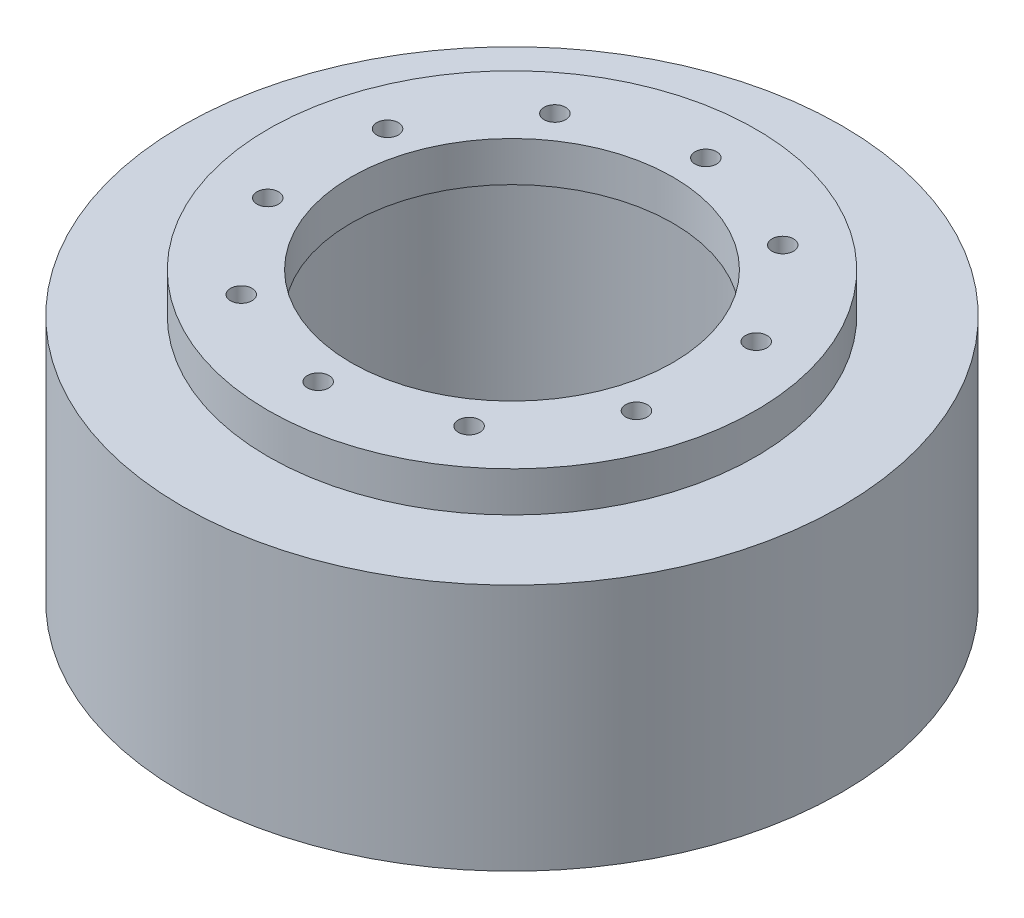
ISO-10303-21;
HEADER;
FILE_DESCRIPTION(('STEP AP214'),'2;1');
FILE_NAME('part.step','',(''),(''),'','','');
FILE_SCHEMA(('AUTOMOTIVE_DESIGN { 1 0 10303 214 1 1 1 1 }'));
ENDSEC;
DATA;
#1=APPLICATION_CONTEXT('core data for automotive mechanical design processes');
#2=APPLICATION_PROTOCOL_DEFINITION('international standard','automotive_design',2000,#1);
#3=PRODUCT_CONTEXT('',#1,'mechanical');
#4=PRODUCT('Part','Part','',(#3));
#5=PRODUCT_RELATED_PRODUCT_CATEGORY('part','',(#4));
#6=PRODUCT_DEFINITION_FORMATION('','',#4);
#7=PRODUCT_DEFINITION_CONTEXT('part definition',#1,'design');
#8=PRODUCT_DEFINITION('design','',#6,#7);
#9=PRODUCT_DEFINITION_SHAPE('','',#8);
#10=(LENGTH_UNIT() NAMED_UNIT(*) SI_UNIT(.MILLI.,.METRE.));
#11=(NAMED_UNIT(*) PLANE_ANGLE_UNIT() SI_UNIT($,.RADIAN.));
#12=(NAMED_UNIT(*) SI_UNIT($,.STERADIAN.) SOLID_ANGLE_UNIT());
#13=UNCERTAINTY_MEASURE_WITH_UNIT(LENGTH_MEASURE(1.E-05),#10,'distance_accuracy_value','');
#14=(GEOMETRIC_REPRESENTATION_CONTEXT(3) GLOBAL_UNCERTAINTY_ASSIGNED_CONTEXT((#13)) GLOBAL_UNIT_ASSIGNED_CONTEXT((#10,
#11,#12)) REPRESENTATION_CONTEXT('',''));
#15=CARTESIAN_POINT('',(0.,0.,0.));
#16=DIRECTION('',(0.,0.,1.));
#17=DIRECTION('',(1.,0.,0.));
#18=AXIS2_PLACEMENT_3D('',#15,#16,#17);
#19=CARTESIAN_POINT('',(0.,0.,0.));
#20=DIRECTION('',(0.,1.,0.));
#21=DIRECTION('',(0.,0.,1.));
#22=AXIS2_PLACEMENT_3D('',#19,#20,#21);
#23=PLANE('',#22);
#24=CARTESIAN_POINT('',(0.,0.,0.));
#25=DIRECTION('',(0.,1.,0.));
#26=DIRECTION('',(0.,0.,1.));
#27=AXIS2_PLACEMENT_3D('',#24,#25,#26);
#28=CIRCLE('',#27,82.5);
#29=CARTESIAN_POINT('',(0.,0.,82.5));
#30=VERTEX_POINT('',#29);
#31=EDGE_CURVE('E282',#30,#30,#28,.T.);
#32=ORIENTED_EDGE('',*,*,#31,.F.);
#33=EDGE_LOOP('',(#32));
#34=FACE_BOUND('',#33,.T.);
#35=CARTESIAN_POINT('',(0.,0.,69.5));
#36=DIRECTION('',(0.,-1.,0.));
#37=DIRECTION('',(0.,0.,-1.));
#38=AXIS2_PLACEMENT_3D('',#35,#36,#37);
#39=CIRCLE('',#38,4.66);
#40=CARTESIAN_POINT('',(0.,0.,64.84));
#41=VERTEX_POINT('',#40);
#42=EDGE_CURVE('E195',#41,#41,#39,.T.);
#43=ORIENTED_EDGE('',*,*,#42,.F.);
#44=EDGE_LOOP('',(#43));
#45=FACE_BOUND('',#44,.T.);
#46=CARTESIAN_POINT('',(60.1887655630186,0.,34.7499999999999));
#47=DIRECTION('',(0.,-1.,0.));
#48=DIRECTION('',(-0.86602540378444,0.,-0.499999999999998));
#49=AXIS2_PLACEMENT_3D('',#46,#47,#48);
#50=CIRCLE('',#49,4.66);
#51=CARTESIAN_POINT('',(56.1530871813831,0.,32.4199999999999));
#52=VERTEX_POINT('',#51);
#53=EDGE_CURVE('E171',#52,#52,#50,.T.);
#54=ORIENTED_EDGE('',*,*,#53,.F.);
#55=EDGE_LOOP('',(#54));
#56=FACE_BOUND('',#55,.T.);
#57=CARTESIAN_POINT('',(60.1887655630183,0.,-34.7500000000003));
#58=DIRECTION('',(0.,-1.,0.));
#59=DIRECTION('',(-0.866025403784436,0.,0.500000000000004));
#60=AXIS2_PLACEMENT_3D('',#57,#58,#59);
#61=CIRCLE('',#60,4.66);
#62=CARTESIAN_POINT('',(56.1530871813829,0.,-32.4200000000003));
#63=VERTEX_POINT('',#62);
#64=EDGE_CURVE('E172',#63,#63,#61,.T.);
#65=ORIENTED_EDGE('',*,*,#64,.F.);
#66=EDGE_LOOP('',(#65));
#67=FACE_BOUND('',#66,.T.);
#68=CARTESIAN_POINT('',(0.,0.,-69.5));
#69=DIRECTION('',(0.,-1.,0.));
#70=DIRECTION('',(0.,0.,1.));
#71=AXIS2_PLACEMENT_3D('',#68,#69,#70);
#72=CIRCLE('',#71,4.66);
#73=CARTESIAN_POINT('',(0.,0.,-64.84));
#74=VERTEX_POINT('',#73);
#75=EDGE_CURVE('E178',#74,#74,#72,.T.);
#76=ORIENTED_EDGE('',*,*,#75,.F.);
#77=EDGE_LOOP('',(#76));
#78=FACE_BOUND('',#77,.T.);
#79=CARTESIAN_POINT('',(-60.1887655630188,0.,-34.7499999999994));
#80=DIRECTION('',(0.,-1.,0.));
#81=DIRECTION('',(0.866025403784443,0.,0.499999999999992));
#82=AXIS2_PLACEMENT_3D('',#79,#80,#81);
#83=CIRCLE('',#82,4.66);
#84=CARTESIAN_POINT('',(-56.1530871813833,0.,-32.4199999999995));
#85=VERTEX_POINT('',#84);
#86=EDGE_CURVE('E184',#85,#85,#83,.T.);
#87=ORIENTED_EDGE('',*,*,#86,.F.);
#88=EDGE_LOOP('',(#87));
#89=FACE_BOUND('',#88,.T.);
#90=CARTESIAN_POINT('',(-60.1887655630181,0.,34.7500000000007));
#91=DIRECTION('',(0.,-1.,0.));
#92=DIRECTION('',(0.866025403784433,0.,-0.50000000000001));
#93=AXIS2_PLACEMENT_3D('',#90,#91,#92);
#94=CIRCLE('',#93,4.66);
#95=CARTESIAN_POINT('',(-56.1530871813826,0.,32.4200000000007));
#96=VERTEX_POINT('',#95);
#97=EDGE_CURVE('E161',#96,#96,#94,.T.);
#98=ORIENTED_EDGE('',*,*,#97,.F.);
#99=EDGE_LOOP('',(#98));
#100=FACE_BOUND('',#99,.T.);
#101=DIRECTION('',(1.,0.,0.));
#102=VECTOR('',#101,1.);
#103=CARTESIAN_POINT('',(-71.0367514640186,0.,20.5));
#104=LINE('',#103,#102);
#105=CARTESIAN_POINT('',(-71.0367514640186,0.,20.5));
#106=VERTEX_POINT('',#105);
#107=CARTESIAN_POINT('',(-51.0367514640186,0.,20.5));
#108=VERTEX_POINT('',#107);
#109=EDGE_CURVE('E125',#106,#108,#104,.T.);
#110=ORIENTED_EDGE('',*,*,#109,.T.);
#111=CARTESIAN_POINT('',(0.,0.,0.));
#112=DIRECTION('',(0.,1.,0.));
#113=DIRECTION('',(0.,0.,1.));
#114=AXIS2_PLACEMENT_3D('',#111,#112,#113);
#115=CIRCLE('',#114,55.);
#116=CARTESIAN_POINT('',(51.0367514640186,0.,20.5));
#117=VERTEX_POINT('',#116);
#118=EDGE_CURVE('E278',#108,#117,#115,.T.);
#119=ORIENTED_EDGE('',*,*,#118,.T.);
#120=DIRECTION('',(-1.,0.,0.));
#121=VECTOR('',#120,1.);
#122=CARTESIAN_POINT('',(71.0367514640186,0.,20.5));
#123=LINE('',#122,#121);
#124=CARTESIAN_POINT('',(71.0367514640186,0.,20.5));
#125=VERTEX_POINT('',#124);
#126=EDGE_CURVE('E154',#125,#117,#123,.T.);
#127=ORIENTED_EDGE('',*,*,#126,.F.);
#128=DIRECTION('',(0.,0.,1.));
#129=VECTOR('',#128,1.);
#130=CARTESIAN_POINT('',(71.0367514640186,0.,-20.5));
#131=LINE('',#130,#129);
#132=CARTESIAN_POINT('',(71.0367514640186,0.,-20.5));
#133=VERTEX_POINT('',#132);
#134=EDGE_CURVE('E140',#133,#125,#131,.T.);
#135=ORIENTED_EDGE('',*,*,#134,.F.);
#136=DIRECTION('',(1.,0.,0.));
#137=VECTOR('',#136,1.);
#138=CARTESIAN_POINT('',(71.0367514640186,0.,-20.5));
#139=LINE('',#138,#137);
#140=CARTESIAN_POINT('',(51.0367514640186,0.,-20.5));
#141=VERTEX_POINT('',#140);
#142=EDGE_CURVE('E146',#141,#133,#139,.T.);
#143=ORIENTED_EDGE('',*,*,#142,.F.);
#144=CARTESIAN_POINT('',(-51.0367514640186,0.,-20.5));
#145=VERTEX_POINT('',#144);
#146=EDGE_CURVE('E279',#141,#145,#115,.T.);
#147=ORIENTED_EDGE('',*,*,#146,.T.);
#148=DIRECTION('',(-1.,0.,0.));
#149=VECTOR('',#148,1.);
#150=CARTESIAN_POINT('',(-71.0367514640186,0.,-20.5));
#151=LINE('',#150,#149);
#152=CARTESIAN_POINT('',(-71.0367514640186,0.,-20.5));
#153=VERTEX_POINT('',#152);
#154=EDGE_CURVE('E128',#145,#153,#151,.T.);
#155=ORIENTED_EDGE('',*,*,#154,.T.);
#156=DIRECTION('',(0.,0.,1.));
#157=VECTOR('',#156,1.);
#158=CARTESIAN_POINT('',(-71.0367514640186,0.,-20.5));
#159=LINE('',#158,#157);
#160=EDGE_CURVE('E120',#153,#106,#159,.T.);
#161=ORIENTED_EDGE('',*,*,#160,.T.);
#162=EDGE_LOOP('',(#110,#119,#127,#135,#143,#147,#155,#161));
#163=FACE_BOUND('',#162,.T.);
#164=ADVANCED_FACE('F41',(#34,#45,#56,#67,#78,#89,#100,#163),#23,.F.);
#165=CARTESIAN_POINT('',(0.,62.,0.));
#166=DIRECTION('',(0.,-1.,0.));
#167=DIRECTION('',(0.,0.,-1.));
#168=AXIS2_PLACEMENT_3D('',#165,#166,#167);
#169=CYLINDRICAL_SURFACE('',#168,55.);
#170=CARTESIAN_POINT('',(0.,62.,0.));
#171=DIRECTION('',(0.,1.,0.));
#172=DIRECTION('',(0.,0.,1.));
#173=AXIS2_PLACEMENT_3D('',#170,#171,#172);
#174=CIRCLE('',#173,55.);
#175=CARTESIAN_POINT('',(0.,62.,55.));
#176=VERTEX_POINT('',#175);
#177=EDGE_CURVE('E273',#176,#176,#174,.T.);
#178=ORIENTED_EDGE('',*,*,#177,.T.);
#179=EDGE_LOOP('',(#178));
#180=FACE_BOUND('',#179,.T.);
#181=ORIENTED_EDGE('',*,*,#118,.F.);
#182=DIRECTION('',(0.,-1.,0.));
#183=VECTOR('',#182,1.);
#184=CARTESIAN_POINT('',(-51.0367514640186,11.3,20.5));
#185=LINE('',#184,#183);
#186=CARTESIAN_POINT('',(-51.0367514640186,11.3,20.5));
#187=VERTEX_POINT('',#186);
#188=EDGE_CURVE('E141',#187,#108,#185,.T.);
#189=ORIENTED_EDGE('',*,*,#188,.F.);
#190=CARTESIAN_POINT('',(0.,11.3,0.));
#191=DIRECTION('',(0.,-1.,0.));
#192=DIRECTION('',(0.,0.,-1.));
#193=AXIS2_PLACEMENT_3D('',#190,#191,#192);
#194=CIRCLE('',#193,55.);
#195=CARTESIAN_POINT('',(-51.0367514640186,11.3,-20.5));
#196=VERTEX_POINT('',#195);
#197=EDGE_CURVE('E11',#187,#196,#194,.T.);
#198=ORIENTED_EDGE('',*,*,#197,.T.);
#199=DIRECTION('',(0.,-1.,0.));
#200=VECTOR('',#199,1.);
#201=CARTESIAN_POINT('',(-51.0367514640186,11.3,-20.5));
#202=LINE('',#201,#200);
#203=EDGE_CURVE('E110',#196,#145,#202,.T.);
#204=ORIENTED_EDGE('',*,*,#203,.T.);
#205=ORIENTED_EDGE('',*,*,#146,.F.);
#206=DIRECTION('',(0.,-1.,0.));
#207=VECTOR('',#206,1.);
#208=CARTESIAN_POINT('',(51.0367514640186,11.3,-20.5));
#209=LINE('',#208,#207);
#210=CARTESIAN_POINT('',(51.0367514640186,11.3,-20.5));
#211=VERTEX_POINT('',#210);
#212=EDGE_CURVE('E162',#211,#141,#209,.T.);
#213=ORIENTED_EDGE('',*,*,#212,.F.);
#214=CARTESIAN_POINT('',(0.,11.3,0.));
#215=DIRECTION('',(0.,-1.,0.));
#216=DIRECTION('',(0.,0.,-1.));
#217=AXIS2_PLACEMENT_3D('',#214,#215,#216);
#218=CIRCLE('',#217,55.);
#219=CARTESIAN_POINT('',(51.0367514640186,11.3,20.5));
#220=VERTEX_POINT('',#219);
#221=EDGE_CURVE('E49',#211,#220,#218,.T.);
#222=ORIENTED_EDGE('',*,*,#221,.T.);
#223=DIRECTION('',(0.,-1.,0.));
#224=VECTOR('',#223,1.);
#225=CARTESIAN_POINT('',(51.0367514640186,11.3,20.5));
#226=LINE('',#225,#224);
#227=EDGE_CURVE('E164',#220,#117,#226,.T.);
#228=ORIENTED_EDGE('',*,*,#227,.T.);
#229=EDGE_LOOP('',(#181,#189,#198,#204,#205,#213,#222,#228));
#230=FACE_BOUND('',#229,.T.);
#231=ADVANCED_FACE('F291',(#180,#230),#169,.F.);
#232=CARTESIAN_POINT('',(0.,62.,0.));
#233=DIRECTION('',(0.,1.,0.));
#234=DIRECTION('',(0.,0.,1.));
#235=AXIS2_PLACEMENT_3D('',#232,#233,#234);
#236=PLANE('',#235);
#237=CARTESIAN_POINT('',(0.,62.,0.));
#238=DIRECTION('',(0.,1.,0.));
#239=DIRECTION('',(0.,0.,1.));
#240=AXIS2_PLACEMENT_3D('',#237,#238,#239);
#241=CIRCLE('',#240,61.);
#242=CARTESIAN_POINT('',(0.,62.,61.));
#243=VERTEX_POINT('',#242);
#244=EDGE_CURVE('E267',#243,#243,#241,.T.);
#245=ORIENTED_EDGE('',*,*,#244,.F.);
#246=EDGE_LOOP('',(#245));
#247=FACE_BOUND('',#246,.T.);
#248=CARTESIAN_POINT('',(0.,62.,0.));
#249=DIRECTION('',(0.,1.,0.));
#250=DIRECTION('',(0.,0.,1.));
#251=AXIS2_PLACEMENT_3D('',#248,#249,#250);
#252=CIRCLE('',#251,82.5);
#253=CARTESIAN_POINT('',(0.,62.,82.5));
#254=VERTEX_POINT('',#253);
#255=EDGE_CURVE('E283',#254,#254,#252,.T.);
#256=ORIENTED_EDGE('',*,*,#255,.T.);
#257=EDGE_LOOP('',(#256));
#258=FACE_BOUND('',#257,.T.);
#259=ADVANCED_FACE('F324',(#247,#258),#236,.T.);
#260=CARTESIAN_POINT('',(0.,62.,0.));
#261=DIRECTION('',(0.,-1.,0.));
#262=DIRECTION('',(0.,0.,-1.));
#263=AXIS2_PLACEMENT_3D('',#260,#261,#262);
#264=CYLINDRICAL_SURFACE('',#263,82.5);
#265=ORIENTED_EDGE('',*,*,#255,.F.);
#266=EDGE_LOOP('',(#265));
#267=FACE_BOUND('',#266,.T.);
#268=ORIENTED_EDGE('',*,*,#31,.T.);
#269=EDGE_LOOP('',(#268));
#270=FACE_BOUND('',#269,.T.);
#271=ADVANCED_FACE('F43',(#267,#270),#264,.T.);
#272=CARTESIAN_POINT('',(0.,62.,0.));
#273=DIRECTION('',(0.,1.,0.));
#274=DIRECTION('',(0.,0.,1.));
#275=AXIS2_PLACEMENT_3D('',#272,#273,#274);
#276=PLANE('',#275);
#277=CARTESIAN_POINT('',(28.5075847361844,62.,-39.2373242271853));
#278=DIRECTION('',(0.,1.,0.));
#279=DIRECTION('',(0.,0.,1.));
#280=AXIS2_PLACEMENT_3D('',#277,#278,#279);
#281=CIRCLE('',#280,2.7);
#282=CARTESIAN_POINT('',(28.5075847361844,62.,-36.5373242271853));
#283=VERTEX_POINT('',#282);
#284=EDGE_CURVE('E254',#283,#283,#281,.T.);
#285=ORIENTED_EDGE('',*,*,#284,.T.);
#286=EDGE_LOOP('',(#285));
#287=FACE_BOUND('',#286,.T.);
#288=CARTESIAN_POINT('',(46.1262410403148,62.,-14.9873242271855));
#289=DIRECTION('',(0.,1.,0.));
#290=DIRECTION('',(0.,0.,1.));
#291=AXIS2_PLACEMENT_3D('',#288,#289,#290);
#292=CIRCLE('',#291,2.7);
#293=CARTESIAN_POINT('',(46.1262410403148,62.,-12.2873242271855));
#294=VERTEX_POINT('',#293);
#295=EDGE_CURVE('E251',#294,#294,#292,.T.);
#296=ORIENTED_EDGE('',*,*,#295,.T.);
#297=EDGE_LOOP('',(#296));
#298=FACE_BOUND('',#297,.T.);
#299=CARTESIAN_POINT('',(46.1262410403151,62.,14.9873242271845));
#300=DIRECTION('',(0.,1.,0.));
#301=DIRECTION('',(0.,0.,1.));
#302=AXIS2_PLACEMENT_3D('',#299,#300,#301);
#303=CIRCLE('',#302,2.7);
#304=CARTESIAN_POINT('',(46.1262410403151,62.,17.6873242271845));
#305=VERTEX_POINT('',#304);
#306=EDGE_CURVE('E248',#305,#305,#303,.T.);
#307=ORIENTED_EDGE('',*,*,#306,.T.);
#308=EDGE_LOOP('',(#307));
#309=FACE_BOUND('',#308,.T.);
#310=CARTESIAN_POINT('',(28.5075847361853,62.,39.2373242271847));
#311=DIRECTION('',(0.,1.,0.));
#312=DIRECTION('',(0.,0.,1.));
#313=AXIS2_PLACEMENT_3D('',#310,#311,#312);
#314=CIRCLE('',#313,2.7);
#315=CARTESIAN_POINT('',(28.5075847361853,62.,41.9373242271847));
#316=VERTEX_POINT('',#315);
#317=EDGE_CURVE('E245',#316,#316,#314,.T.);
#318=ORIENTED_EDGE('',*,*,#317,.T.);
#319=EDGE_LOOP('',(#318));
#320=FACE_BOUND('',#319,.T.);
#321=CARTESIAN_POINT('',(0.,62.,48.5));
#322=DIRECTION('',(0.,1.,0.));
#323=DIRECTION('',(0.,0.,1.));
#324=AXIS2_PLACEMENT_3D('',#321,#322,#323);
#325=CIRCLE('',#324,2.7);
#326=CARTESIAN_POINT('',(0.,62.,51.2));
#327=VERTEX_POINT('',#326);
#328=EDGE_CURVE('E242',#327,#327,#325,.T.);
#329=ORIENTED_EDGE('',*,*,#328,.T.);
#330=EDGE_LOOP('',(#329));
#331=FACE_BOUND('',#330,.T.);
#332=CARTESIAN_POINT('',(-28.5075847361847,62.,39.2373242271851));
#333=DIRECTION('',(0.,1.,0.));
#334=DIRECTION('',(0.,0.,1.));
#335=AXIS2_PLACEMENT_3D('',#332,#333,#334);
#336=CIRCLE('',#335,2.7);
#337=CARTESIAN_POINT('',(-28.5075847361847,62.,41.9373242271851));
#338=VERTEX_POINT('',#337);
#339=EDGE_CURVE('E239',#338,#338,#336,.T.);
#340=ORIENTED_EDGE('',*,*,#339,.T.);
#341=EDGE_LOOP('',(#340));
#342=FACE_BOUND('',#341,.T.);
#343=CARTESIAN_POINT('',(-46.1262410403149,62.,14.9873242271852));
#344=DIRECTION('',(0.,1.,0.));
#345=DIRECTION('',(0.,0.,1.));
#346=AXIS2_PLACEMENT_3D('',#343,#344,#345);
#347=CIRCLE('',#346,2.7);
#348=CARTESIAN_POINT('',(-46.1262410403149,62.,17.6873242271852));
#349=VERTEX_POINT('',#348);
#350=EDGE_CURVE('E236',#349,#349,#347,.T.);
#351=ORIENTED_EDGE('',*,*,#350,.T.);
#352=EDGE_LOOP('',(#351));
#353=FACE_BOUND('',#352,.T.);
#354=CARTESIAN_POINT('',(-46.126241040315,62.,-14.9873242271848));
#355=DIRECTION('',(0.,1.,0.));
#356=DIRECTION('',(0.,0.,1.));
#357=AXIS2_PLACEMENT_3D('',#354,#355,#356);
#358=CIRCLE('',#357,2.7);
#359=CARTESIAN_POINT('',(-46.126241040315,62.,-12.2873242271848));
#360=VERTEX_POINT('',#359);
#361=EDGE_CURVE('E233',#360,#360,#358,.T.);
#362=ORIENTED_EDGE('',*,*,#361,.T.);
#363=EDGE_LOOP('',(#362));
#364=FACE_BOUND('',#363,.T.);
#365=CARTESIAN_POINT('',(-28.507584736185,62.,-39.2373242271849));
#366=DIRECTION('',(0.,1.,0.));
#367=DIRECTION('',(0.,0.,1.));
#368=AXIS2_PLACEMENT_3D('',#365,#366,#367);
#369=CIRCLE('',#368,2.7);
#370=CARTESIAN_POINT('',(-28.507584736185,62.,-36.5373242271849));
#371=VERTEX_POINT('',#370);
#372=EDGE_CURVE('E230',#371,#371,#369,.T.);
#373=ORIENTED_EDGE('',*,*,#372,.T.);
#374=EDGE_LOOP('',(#373));
#375=FACE_BOUND('',#374,.T.);
#376=CARTESIAN_POINT('',(0.,62.,-48.5));
#377=DIRECTION('',(0.,1.,0.));
#378=DIRECTION('',(0.,0.,1.));
#379=AXIS2_PLACEMENT_3D('',#376,#377,#378);
#380=CIRCLE('',#379,2.7);
#381=CARTESIAN_POINT('',(0.,62.,-45.8));
#382=VERTEX_POINT('',#381);
#383=EDGE_CURVE('E260',#382,#382,#380,.T.);
#384=ORIENTED_EDGE('',*,*,#383,.T.);
#385=EDGE_LOOP('',(#384));
#386=FACE_BOUND('',#385,.T.);
#387=CARTESIAN_POINT('',(0.,62.,0.));
#388=DIRECTION('',(0.,1.,0.));
#389=DIRECTION('',(0.,0.,1.));
#390=AXIS2_PLACEMENT_3D('',#387,#388,#389);
#391=CIRCLE('',#390,40.25);
#392=CARTESIAN_POINT('',(0.,62.,40.25));
#393=VERTEX_POINT('',#392);
#394=EDGE_CURVE('E264',#393,#393,#391,.T.);
#395=ORIENTED_EDGE('',*,*,#394,.T.);
#396=EDGE_LOOP('',(#395));
#397=FACE_BOUND('',#396,.T.);
#398=ORIENTED_EDGE('',*,*,#177,.F.);
#399=EDGE_LOOP('',(#398));
#400=FACE_BOUND('',#399,.T.);
#401=ADVANCED_FACE('F337',(#287,#298,#309,#320,#331,#342,#353,#364,#375,#386,#397,#400),#276,.F.);
#402=CARTESIAN_POINT('',(0.,72.,0.));
#403=DIRECTION('',(0.,-1.,0.));
#404=DIRECTION('',(0.,0.,-1.));
#405=AXIS2_PLACEMENT_3D('',#402,#403,#404);
#406=CYLINDRICAL_SURFACE('',#405,61.);
#407=CARTESIAN_POINT('',(0.,72.,0.));
#408=DIRECTION('',(0.,1.,0.));
#409=DIRECTION('',(0.,0.,1.));
#410=AXIS2_PLACEMENT_3D('',#407,#408,#409);
#411=CIRCLE('',#410,61.);
#412=CARTESIAN_POINT('',(0.,72.,61.));
#413=VERTEX_POINT('',#412);
#414=EDGE_CURVE('E270',#413,#413,#411,.T.);
#415=ORIENTED_EDGE('',*,*,#414,.F.);
#416=EDGE_LOOP('',(#415));
#417=FACE_BOUND('',#416,.T.);
#418=ORIENTED_EDGE('',*,*,#244,.T.);
#419=EDGE_LOOP('',(#418));
#420=FACE_BOUND('',#419,.T.);
#421=ADVANCED_FACE('F333',(#417,#420),#406,.T.);
#422=CARTESIAN_POINT('',(0.,72.,0.));
#423=DIRECTION('',(0.,1.,0.));
#424=DIRECTION('',(0.,0.,1.));
#425=AXIS2_PLACEMENT_3D('',#422,#423,#424);
#426=PLANE('',#425);
#427=CARTESIAN_POINT('',(28.5075847361844,72.,-39.2373242271853));
#428=DIRECTION('',(0.,1.,0.));
#429=DIRECTION('',(-0.587785252292462,0.,0.809016994374955));
#430=AXIS2_PLACEMENT_3D('',#427,#428,#429);
#431=CIRCLE('',#430,2.7);
#432=CARTESIAN_POINT('',(26.9205645549948,72.,-37.0529783423729));
#433=VERTEX_POINT('',#432);
#434=EDGE_CURVE('E201',#433,#433,#431,.T.);
#435=ORIENTED_EDGE('',*,*,#434,.F.);
#436=EDGE_LOOP('',(#435));
#437=FACE_BOUND('',#436,.T.);
#438=CARTESIAN_POINT('',(46.1262410403148,72.,-14.9873242271855));
#439=DIRECTION('',(0.,1.,0.));
#440=DIRECTION('',(-0.95105651629515,0.,0.309016994374958));
#441=AXIS2_PLACEMENT_3D('',#438,#439,#440);
#442=CIRCLE('',#441,2.7);
#443=CARTESIAN_POINT('',(43.5583884463179,72.,-14.1529783423731));
#444=VERTEX_POINT('',#443);
#445=EDGE_CURVE('E223',#444,#444,#442,.T.);
#446=ORIENTED_EDGE('',*,*,#445,.F.);
#447=EDGE_LOOP('',(#446));
#448=FACE_BOUND('',#447,.T.);
#449=CARTESIAN_POINT('',(46.1262410403151,72.,14.9873242271845));
#450=DIRECTION('',(0.,1.,0.));
#451=DIRECTION('',(-0.951056516295157,0.,-0.309016994374938));
#452=AXIS2_PLACEMENT_3D('',#449,#450,#451);
#453=CIRCLE('',#452,2.7);
#454=CARTESIAN_POINT('',(43.5583884463182,72.,14.1529783423722));
#455=VERTEX_POINT('',#454);
#456=EDGE_CURVE('E220',#455,#455,#453,.T.);
#457=ORIENTED_EDGE('',*,*,#456,.F.);
#458=EDGE_LOOP('',(#457));
#459=FACE_BOUND('',#458,.T.);
#460=CARTESIAN_POINT('',(28.5075847361853,72.,39.2373242271847));
#461=DIRECTION('',(0.,1.,0.));
#462=DIRECTION('',(-0.58778525229248,0.,-0.809016994374942));
#463=AXIS2_PLACEMENT_3D('',#460,#461,#462);
#464=CIRCLE('',#463,2.7);
#465=CARTESIAN_POINT('',(26.9205645549956,72.,37.0529783423724));
#466=VERTEX_POINT('',#465);
#467=EDGE_CURVE('E217',#466,#466,#464,.T.);
#468=ORIENTED_EDGE('',*,*,#467,.F.);
#469=EDGE_LOOP('',(#468));
#470=FACE_BOUND('',#469,.T.);
#471=CARTESIAN_POINT('',(0.,72.,48.5));
#472=DIRECTION('',(0.,1.,0.));
#473=DIRECTION('',(0.,0.,-1.));
#474=AXIS2_PLACEMENT_3D('',#471,#472,#473);
#475=CIRCLE('',#474,2.7);
#476=CARTESIAN_POINT('',(0.,72.,45.8));
#477=VERTEX_POINT('',#476);
#478=EDGE_CURVE('E214',#477,#477,#475,.T.);
#479=ORIENTED_EDGE('',*,*,#478,.F.);
#480=EDGE_LOOP('',(#479));
#481=FACE_BOUND('',#480,.T.);
#482=CARTESIAN_POINT('',(-28.5075847361847,72.,39.2373242271851));
#483=DIRECTION('',(0.,1.,0.));
#484=DIRECTION('',(0.587785252292469,0.,-0.809016994374951));
#485=AXIS2_PLACEMENT_3D('',#482,#483,#484);
#486=CIRCLE('',#485,2.7);
#487=CARTESIAN_POINT('',(-26.9205645549951,72.,37.0529783423727));
#488=VERTEX_POINT('',#487);
#489=EDGE_CURVE('E211',#488,#488,#486,.T.);
#490=ORIENTED_EDGE('',*,*,#489,.F.);
#491=EDGE_LOOP('',(#490));
#492=FACE_BOUND('',#491,.T.);
#493=CARTESIAN_POINT('',(-46.1262410403149,72.,14.9873242271852));
#494=DIRECTION('',(0.,1.,0.));
#495=DIRECTION('',(0.951056516295152,0.,-0.309016994374952));
#496=AXIS2_PLACEMENT_3D('',#493,#494,#495);
#497=CIRCLE('',#496,2.7);
#498=CARTESIAN_POINT('',(-43.558388446318,72.,14.1529783423728));
#499=VERTEX_POINT('',#498);
#500=EDGE_CURVE('E208',#499,#499,#497,.T.);
#501=ORIENTED_EDGE('',*,*,#500,.F.);
#502=EDGE_LOOP('',(#501));
#503=FACE_BOUND('',#502,.T.);
#504=CARTESIAN_POINT('',(-46.126241040315,72.,-14.9873242271848));
#505=DIRECTION('',(0.,1.,0.));
#506=DIRECTION('',(0.951056516295155,0.,0.309016994374945));
#507=AXIS2_PLACEMENT_3D('',#504,#505,#506);
#508=CIRCLE('',#507,2.7);
#509=CARTESIAN_POINT('',(-43.5583884463181,72.,-14.1529783423725));
#510=VERTEX_POINT('',#509);
#511=EDGE_CURVE('E204',#510,#510,#508,.T.);
#512=ORIENTED_EDGE('',*,*,#511,.F.);
#513=EDGE_LOOP('',(#512));
#514=FACE_BOUND('',#513,.T.);
#515=CARTESIAN_POINT('',(-28.507584736185,72.,-39.2373242271849));
#516=DIRECTION('',(0.,1.,0.));
#517=DIRECTION('',(0.587785252292474,0.,0.809016994374947));
#518=AXIS2_PLACEMENT_3D('',#515,#516,#517);
#519=CIRCLE('',#518,2.7);
#520=CARTESIAN_POINT('',(-26.9205645549953,72.,-37.0529783423726));
#521=VERTEX_POINT('',#520);
#522=EDGE_CURVE('E207',#521,#521,#519,.T.);
#523=ORIENTED_EDGE('',*,*,#522,.F.);
#524=EDGE_LOOP('',(#523));
#525=FACE_BOUND('',#524,.T.);
#526=CARTESIAN_POINT('',(0.,72.,-48.5));
#527=DIRECTION('',(0.,1.,0.));
#528=DIRECTION('',(0.,0.,1.));
#529=AXIS2_PLACEMENT_3D('',#526,#527,#528);
#530=CIRCLE('',#529,2.7);
#531=CARTESIAN_POINT('',(0.,72.,-45.8));
#532=VERTEX_POINT('',#531);
#533=EDGE_CURVE('E257',#532,#532,#530,.T.);
#534=ORIENTED_EDGE('',*,*,#533,.F.);
#535=EDGE_LOOP('',(#534));
#536=FACE_BOUND('',#535,.T.);
#537=CARTESIAN_POINT('',(0.,72.,0.));
#538=DIRECTION('',(0.,1.,0.));
#539=DIRECTION('',(0.,0.,1.));
#540=AXIS2_PLACEMENT_3D('',#537,#538,#539);
#541=CIRCLE('',#540,40.25);
#542=CARTESIAN_POINT('',(0.,72.,40.25));
#543=VERTEX_POINT('',#542);
#544=EDGE_CURVE('E263',#543,#543,#541,.T.);
#545=ORIENTED_EDGE('',*,*,#544,.F.);
#546=EDGE_LOOP('',(#545));
#547=FACE_BOUND('',#546,.T.);
#548=ORIENTED_EDGE('',*,*,#414,.T.);
#549=EDGE_LOOP('',(#548));
#550=FACE_BOUND('',#549,.T.);
#551=ADVANCED_FACE('F336',(#437,#448,#459,#470,#481,#492,#503,#514,#525,#536,#547,#550),#426,.T.);
#552=CARTESIAN_POINT('',(0.,62.,0.));
#553=DIRECTION('',(0.,1.,0.));
#554=DIRECTION('',(0.,0.,1.));
#555=AXIS2_PLACEMENT_3D('',#552,#553,#554);
#556=CYLINDRICAL_SURFACE('',#555,40.25);
#557=ORIENTED_EDGE('',*,*,#394,.F.);
#558=EDGE_LOOP('',(#557));
#559=FACE_BOUND('',#558,.T.);
#560=ORIENTED_EDGE('',*,*,#544,.T.);
#561=EDGE_LOOP('',(#560));
#562=FACE_BOUND('',#561,.T.);
#563=ADVANCED_FACE('F344',(#559,#562),#556,.F.);
#564=CARTESIAN_POINT('',(0.,42.,-48.5));
#565=DIRECTION('',(0.,1.,0.));
#566=DIRECTION('',(0.,0.,1.));
#567=AXIS2_PLACEMENT_3D('',#564,#565,#566);
#568=CYLINDRICAL_SURFACE('',#567,2.7);
#569=ORIENTED_EDGE('',*,*,#533,.T.);
#570=EDGE_LOOP('',(#569));
#571=FACE_BOUND('',#570,.T.);
#572=ORIENTED_EDGE('',*,*,#383,.F.);
#573=EDGE_LOOP('',(#572));
#574=FACE_BOUND('',#573,.T.);
#575=ADVANCED_FACE('F348',(#571,#574),#568,.F.);
#576=CARTESIAN_POINT('',(-28.507584736185,42.,-39.2373242271849));
#577=DIRECTION('',(0.,1.,0.));
#578=DIRECTION('',(0.,0.,1.));
#579=AXIS2_PLACEMENT_3D('',#576,#577,#578);
#580=CYLINDRICAL_SURFACE('',#579,2.7);
#581=ORIENTED_EDGE('',*,*,#522,.T.);
#582=EDGE_LOOP('',(#581));
#583=FACE_BOUND('',#582,.T.);
#584=ORIENTED_EDGE('',*,*,#372,.F.);
#585=EDGE_LOOP('',(#584));
#586=FACE_BOUND('',#585,.T.);
#587=ADVANCED_FACE('F352',(#583,#586),#580,.F.);
#588=CARTESIAN_POINT('',(-46.126241040315,42.,-14.9873242271848));
#589=DIRECTION('',(0.,1.,0.));
#590=DIRECTION('',(0.,0.,1.));
#591=AXIS2_PLACEMENT_3D('',#588,#589,#590);
#592=CYLINDRICAL_SURFACE('',#591,2.7);
#593=ORIENTED_EDGE('',*,*,#511,.T.);
#594=EDGE_LOOP('',(#593));
#595=FACE_BOUND('',#594,.T.);
#596=ORIENTED_EDGE('',*,*,#361,.F.);
#597=EDGE_LOOP('',(#596));
#598=FACE_BOUND('',#597,.T.);
#599=ADVANCED_FACE('F356',(#595,#598),#592,.F.);
#600=CARTESIAN_POINT('',(-46.1262410403149,42.,14.9873242271852));
#601=DIRECTION('',(0.,1.,0.));
#602=DIRECTION('',(0.,0.,1.));
#603=AXIS2_PLACEMENT_3D('',#600,#601,#602);
#604=CYLINDRICAL_SURFACE('',#603,2.7);
#605=ORIENTED_EDGE('',*,*,#500,.T.);
#606=EDGE_LOOP('',(#605));
#607=FACE_BOUND('',#606,.T.);
#608=ORIENTED_EDGE('',*,*,#350,.F.);
#609=EDGE_LOOP('',(#608));
#610=FACE_BOUND('',#609,.T.);
#611=ADVANCED_FACE('F382',(#607,#610),#604,.F.);
#612=CARTESIAN_POINT('',(-28.5075847361847,42.,39.2373242271851));
#613=DIRECTION('',(0.,1.,0.));
#614=DIRECTION('',(0.,0.,1.));
#615=AXIS2_PLACEMENT_3D('',#612,#613,#614);
#616=CYLINDRICAL_SURFACE('',#615,2.7);
#617=ORIENTED_EDGE('',*,*,#489,.T.);
#618=EDGE_LOOP('',(#617));
#619=FACE_BOUND('',#618,.T.);
#620=ORIENTED_EDGE('',*,*,#339,.F.);
#621=EDGE_LOOP('',(#620));
#622=FACE_BOUND('',#621,.T.);
#623=ADVANCED_FACE('F378',(#619,#622),#616,.F.);
#624=CARTESIAN_POINT('',(0.,42.,48.5));
#625=DIRECTION('',(0.,1.,0.));
#626=DIRECTION('',(0.,0.,1.));
#627=AXIS2_PLACEMENT_3D('',#624,#625,#626);
#628=CYLINDRICAL_SURFACE('',#627,2.7);
#629=ORIENTED_EDGE('',*,*,#478,.T.);
#630=EDGE_LOOP('',(#629));
#631=FACE_BOUND('',#630,.T.);
#632=ORIENTED_EDGE('',*,*,#328,.F.);
#633=EDGE_LOOP('',(#632));
#634=FACE_BOUND('',#633,.T.);
#635=ADVANCED_FACE('F374',(#631,#634),#628,.F.);
#636=CARTESIAN_POINT('',(28.5075847361853,42.,39.2373242271847));
#637=DIRECTION('',(0.,1.,0.));
#638=DIRECTION('',(0.,0.,1.));
#639=AXIS2_PLACEMENT_3D('',#636,#637,#638);
#640=CYLINDRICAL_SURFACE('',#639,2.7);
#641=ORIENTED_EDGE('',*,*,#467,.T.);
#642=EDGE_LOOP('',(#641));
#643=FACE_BOUND('',#642,.T.);
#644=ORIENTED_EDGE('',*,*,#317,.F.);
#645=EDGE_LOOP('',(#644));
#646=FACE_BOUND('',#645,.T.);
#647=ADVANCED_FACE('F370',(#643,#646),#640,.F.);
#648=CARTESIAN_POINT('',(46.1262410403151,42.,14.9873242271845));
#649=DIRECTION('',(0.,1.,0.));
#650=DIRECTION('',(0.,0.,1.));
#651=AXIS2_PLACEMENT_3D('',#648,#649,#650);
#652=CYLINDRICAL_SURFACE('',#651,2.7);
#653=ORIENTED_EDGE('',*,*,#456,.T.);
#654=EDGE_LOOP('',(#653));
#655=FACE_BOUND('',#654,.T.);
#656=ORIENTED_EDGE('',*,*,#306,.F.);
#657=EDGE_LOOP('',(#656));
#658=FACE_BOUND('',#657,.T.);
#659=ADVANCED_FACE('F366',(#655,#658),#652,.F.);
#660=CARTESIAN_POINT('',(46.1262410403148,42.,-14.9873242271855));
#661=DIRECTION('',(0.,1.,0.));
#662=DIRECTION('',(0.,0.,1.));
#663=AXIS2_PLACEMENT_3D('',#660,#661,#662);
#664=CYLINDRICAL_SURFACE('',#663,2.7);
#665=ORIENTED_EDGE('',*,*,#445,.T.);
#666=EDGE_LOOP('',(#665));
#667=FACE_BOUND('',#666,.T.);
#668=ORIENTED_EDGE('',*,*,#295,.F.);
#669=EDGE_LOOP('',(#668));
#670=FACE_BOUND('',#669,.T.);
#671=ADVANCED_FACE('F362',(#667,#670),#664,.F.);
#672=CARTESIAN_POINT('',(28.5075847361844,42.,-39.2373242271853));
#673=DIRECTION('',(0.,1.,0.));
#674=DIRECTION('',(0.,0.,1.));
#675=AXIS2_PLACEMENT_3D('',#672,#673,#674);
#676=CYLINDRICAL_SURFACE('',#675,2.7);
#677=ORIENTED_EDGE('',*,*,#434,.T.);
#678=EDGE_LOOP('',(#677));
#679=FACE_BOUND('',#678,.T.);
#680=ORIENTED_EDGE('',*,*,#284,.F.);
#681=EDGE_LOOP('',(#680));
#682=FACE_BOUND('',#681,.T.);
#683=ADVANCED_FACE('F358',(#679,#682),#676,.F.);
#684=CARTESIAN_POINT('',(0.,7.62,69.5));
#685=DIRECTION('',(0.,-1.,0.));
#686=DIRECTION('',(0.,0.,-1.));
#687=AXIS2_PLACEMENT_3D('',#684,#685,#686);
#688=CYLINDRICAL_SURFACE('',#687,4.66);
#689=CARTESIAN_POINT('',(0.,7.62,69.5));
#690=DIRECTION('',(0.,-1.,0.));
#691=DIRECTION('',(0.,0.,-1.));
#692=AXIS2_PLACEMENT_3D('',#689,#690,#691);
#693=CIRCLE('',#692,4.66);
#694=CARTESIAN_POINT('',(0.,7.62,64.84));
#695=VERTEX_POINT('',#694);
#696=EDGE_CURVE('E198',#695,#695,#693,.T.);
#697=ORIENTED_EDGE('',*,*,#696,.F.);
#698=EDGE_LOOP('',(#697));
#699=FACE_BOUND('',#698,.T.);
#700=ORIENTED_EDGE('',*,*,#42,.T.);
#701=EDGE_LOOP('',(#700));
#702=FACE_BOUND('',#701,.T.);
#703=ADVANCED_FACE('F361',(#699,#702),#688,.F.);
#704=CARTESIAN_POINT('',(0.,7.62,69.5));
#705=DIRECTION('',(0.,-1.,0.));
#706=DIRECTION('',(0.,0.,-1.));
#707=AXIS2_PLACEMENT_3D('',#704,#705,#706);
#708=PLANE('',#707);
#709=ORIENTED_EDGE('',*,*,#696,.T.);
#710=EDGE_LOOP('',(#709));
#711=FACE_BOUND('',#710,.T.);
#712=ADVANCED_FACE('F392',(#711),#708,.T.);
#713=CARTESIAN_POINT('',(60.1887655630186,7.62,34.7499999999999));
#714=DIRECTION('',(0.,-1.,0.));
#715=DIRECTION('',(0.,0.,-1.));
#716=AXIS2_PLACEMENT_3D('',#713,#714,#715);
#717=CYLINDRICAL_SURFACE('',#716,4.66);
#718=CARTESIAN_POINT('',(60.1887655630186,7.62,34.7499999999999));
#719=DIRECTION('',(0.,-1.,0.));
#720=DIRECTION('',(-0.86602540378444,0.,-0.499999999999998));
#721=AXIS2_PLACEMENT_3D('',#718,#719,#720);
#722=CIRCLE('',#721,4.66);
#723=CARTESIAN_POINT('',(56.1530871813831,7.62,32.4199999999999));
#724=VERTEX_POINT('',#723);
#725=EDGE_CURVE('E192',#724,#724,#722,.T.);
#726=ORIENTED_EDGE('',*,*,#725,.F.);
#727=EDGE_LOOP('',(#726));
#728=FACE_BOUND('',#727,.T.);
#729=ORIENTED_EDGE('',*,*,#53,.T.);
#730=EDGE_LOOP('',(#729));
#731=FACE_BOUND('',#730,.T.);
#732=ADVANCED_FACE('F396',(#728,#731),#717,.F.);
#733=CARTESIAN_POINT('',(60.1887655630186,7.62,34.7499999999999));
#734=DIRECTION('',(0.,-1.,0.));
#735=DIRECTION('',(-0.86602540378444,0.,-0.499999999999998));
#736=AXIS2_PLACEMENT_3D('',#733,#734,#735);
#737=PLANE('',#736);
#738=ORIENTED_EDGE('',*,*,#725,.T.);
#739=EDGE_LOOP('',(#738));
#740=FACE_BOUND('',#739,.T.);
#741=ADVANCED_FACE('F400',(#740),#737,.T.);
#742=CARTESIAN_POINT('',(60.1887655630183,7.62,-34.7500000000003));
#743=DIRECTION('',(0.,-1.,0.));
#744=DIRECTION('',(0.,0.,-1.));
#745=AXIS2_PLACEMENT_3D('',#742,#743,#744);
#746=CYLINDRICAL_SURFACE('',#745,4.66);
#747=CARTESIAN_POINT('',(60.1887655630183,7.62,-34.7500000000003));
#748=DIRECTION('',(0.,-1.,0.));
#749=DIRECTION('',(-0.866025403784436,0.,0.500000000000004));
#750=AXIS2_PLACEMENT_3D('',#747,#748,#749);
#751=CIRCLE('',#750,4.66);
#752=CARTESIAN_POINT('',(56.1530871813829,7.62,-32.4200000000003));
#753=VERTEX_POINT('',#752);
#754=EDGE_CURVE('E168',#753,#753,#751,.T.);
#755=ORIENTED_EDGE('',*,*,#754,.F.);
#756=EDGE_LOOP('',(#755));
#757=FACE_BOUND('',#756,.T.);
#758=ORIENTED_EDGE('',*,*,#64,.T.);
#759=EDGE_LOOP('',(#758));
#760=FACE_BOUND('',#759,.T.);
#761=ADVANCED_FACE('F404',(#757,#760),#746,.F.);
#762=CARTESIAN_POINT('',(60.1887655630183,7.62,-34.7500000000003));
#763=DIRECTION('',(0.,-1.,0.));
#764=DIRECTION('',(-0.866025403784436,0.,0.500000000000004));
#765=AXIS2_PLACEMENT_3D('',#762,#763,#764);
#766=PLANE('',#765);
#767=ORIENTED_EDGE('',*,*,#754,.T.);
#768=EDGE_LOOP('',(#767));
#769=FACE_BOUND('',#768,.T.);
#770=ADVANCED_FACE('F426',(#769),#766,.T.);
#771=CARTESIAN_POINT('',(0.,7.62,-69.5));
#772=DIRECTION('',(0.,-1.,0.));
#773=DIRECTION('',(0.,0.,-1.));
#774=AXIS2_PLACEMENT_3D('',#771,#772,#773);
#775=CYLINDRICAL_SURFACE('',#774,4.66);
#776=CARTESIAN_POINT('',(0.,7.62,-69.5));
#777=DIRECTION('',(0.,-1.,0.));
#778=DIRECTION('',(0.,0.,1.));
#779=AXIS2_PLACEMENT_3D('',#776,#777,#778);
#780=CIRCLE('',#779,4.66);
#781=CARTESIAN_POINT('',(0.,7.62,-64.84));
#782=VERTEX_POINT('',#781);
#783=EDGE_CURVE('E175',#782,#782,#780,.T.);
#784=ORIENTED_EDGE('',*,*,#783,.F.);
#785=EDGE_LOOP('',(#784));
#786=FACE_BOUND('',#785,.T.);
#787=ORIENTED_EDGE('',*,*,#75,.T.);
#788=EDGE_LOOP('',(#787));
#789=FACE_BOUND('',#788,.T.);
#790=ADVANCED_FACE('F423',(#786,#789),#775,.F.);
#791=CARTESIAN_POINT('',(0.,7.62,-69.5));
#792=DIRECTION('',(0.,-1.,0.));
#793=DIRECTION('',(0.,0.,1.));
#794=AXIS2_PLACEMENT_3D('',#791,#792,#793);
#795=PLANE('',#794);
#796=ORIENTED_EDGE('',*,*,#783,.T.);
#797=EDGE_LOOP('',(#796));
#798=FACE_BOUND('',#797,.T.);
#799=ADVANCED_FACE('F418',(#798),#795,.T.);
#800=CARTESIAN_POINT('',(-60.1887655630188,7.62,-34.7499999999994));
#801=DIRECTION('',(0.,-1.,0.));
#802=DIRECTION('',(0.,0.,-1.));
#803=AXIS2_PLACEMENT_3D('',#800,#801,#802);
#804=CYLINDRICAL_SURFACE('',#803,4.66);
#805=CARTESIAN_POINT('',(-60.1887655630188,7.62,-34.7499999999994));
#806=DIRECTION('',(0.,-1.,0.));
#807=DIRECTION('',(0.866025403784443,0.,0.499999999999992));
#808=AXIS2_PLACEMENT_3D('',#805,#806,#807);
#809=CIRCLE('',#808,4.66);
#810=CARTESIAN_POINT('',(-56.1530871813833,7.62,-32.4199999999995));
#811=VERTEX_POINT('',#810);
#812=EDGE_CURVE('E181',#811,#811,#809,.T.);
#813=ORIENTED_EDGE('',*,*,#812,.F.);
#814=EDGE_LOOP('',(#813));
#815=FACE_BOUND('',#814,.T.);
#816=ORIENTED_EDGE('',*,*,#86,.T.);
#817=EDGE_LOOP('',(#816));
#818=FACE_BOUND('',#817,.T.);
#819=ADVANCED_FACE('F415',(#815,#818),#804,.F.);
#820=CARTESIAN_POINT('',(-60.1887655630188,7.62,-34.7499999999994));
#821=DIRECTION('',(0.,-1.,0.));
#822=DIRECTION('',(0.866025403784443,0.,0.499999999999992));
#823=AXIS2_PLACEMENT_3D('',#820,#821,#822);
#824=PLANE('',#823);
#825=ORIENTED_EDGE('',*,*,#812,.T.);
#826=EDGE_LOOP('',(#825));
#827=FACE_BOUND('',#826,.T.);
#828=ADVANCED_FACE('F410',(#827),#824,.T.);
#829=CARTESIAN_POINT('',(-60.1887655630181,7.62,34.7500000000007));
#830=DIRECTION('',(0.,-1.,0.));
#831=DIRECTION('',(0.,0.,-1.));
#832=AXIS2_PLACEMENT_3D('',#829,#830,#831);
#833=CYLINDRICAL_SURFACE('',#832,4.66);
#834=CARTESIAN_POINT('',(-60.1887655630181,7.62,34.7500000000007));
#835=DIRECTION('',(0.,-1.,0.));
#836=DIRECTION('',(0.866025403784433,0.,-0.50000000000001));
#837=AXIS2_PLACEMENT_3D('',#834,#835,#836);
#838=CIRCLE('',#837,4.66);
#839=CARTESIAN_POINT('',(-56.1530871813826,7.62,32.4200000000007));
#840=VERTEX_POINT('',#839);
#841=EDGE_CURVE('E187',#840,#840,#838,.T.);
#842=ORIENTED_EDGE('',*,*,#841,.F.);
#843=EDGE_LOOP('',(#842));
#844=FACE_BOUND('',#843,.T.);
#845=ORIENTED_EDGE('',*,*,#97,.T.);
#846=EDGE_LOOP('',(#845));
#847=FACE_BOUND('',#846,.T.);
#848=ADVANCED_FACE('F406',(#844,#847),#833,.F.);
#849=CARTESIAN_POINT('',(-60.1887655630181,7.62,34.7500000000007));
#850=DIRECTION('',(0.,-1.,0.));
#851=DIRECTION('',(0.866025403784433,0.,-0.50000000000001));
#852=AXIS2_PLACEMENT_3D('',#849,#850,#851);
#853=PLANE('',#852);
#854=ORIENTED_EDGE('',*,*,#841,.T.);
#855=EDGE_LOOP('',(#854));
#856=FACE_BOUND('',#855,.T.);
#857=ADVANCED_FACE('F409',(#856),#853,.T.);
#858=CARTESIAN_POINT('',(71.0367514640186,11.3,-20.5));
#859=DIRECTION('',(1.,0.,0.));
#860=DIRECTION('',(0.,0.,-1.));
#861=AXIS2_PLACEMENT_3D('',#858,#859,#860);
#862=PLANE('',#861);
#863=ORIENTED_EDGE('',*,*,#134,.T.);
#864=DIRECTION('',(0.,-1.,0.));
#865=VECTOR('',#864,1.);
#866=CARTESIAN_POINT('',(71.0367514640186,11.3,20.5));
#867=LINE('',#866,#865);
#868=CARTESIAN_POINT('',(71.0367514640186,11.3,20.5));
#869=VERTEX_POINT('',#868);
#870=EDGE_CURVE('E151',#869,#125,#867,.T.);
#871=ORIENTED_EDGE('',*,*,#870,.F.);
#872=DIRECTION('',(0.,0.,1.));
#873=VECTOR('',#872,1.);
#874=CARTESIAN_POINT('',(71.0367514640186,11.3,-20.5));
#875=LINE('',#874,#873);
#876=CARTESIAN_POINT('',(71.0367514640186,11.3,-20.5));
#877=VERTEX_POINT('',#876);
#878=EDGE_CURVE('E144',#877,#869,#875,.T.);
#879=ORIENTED_EDGE('',*,*,#878,.F.);
#880=DIRECTION('',(0.,-1.,0.));
#881=VECTOR('',#880,1.);
#882=CARTESIAN_POINT('',(71.0367514640186,11.3,-20.5));
#883=LINE('',#882,#881);
#884=EDGE_CURVE('E159',#877,#133,#883,.T.);
#885=ORIENTED_EDGE('',*,*,#884,.T.);
#886=EDGE_LOOP('',(#863,#871,#879,#885));
#887=FACE_BOUND('',#886,.T.);
#888=ADVANCED_FACE('F301',(#887),#862,.F.);
#889=CARTESIAN_POINT('',(71.0367514640186,11.3,-20.5));
#890=DIRECTION('',(0.,0.,-1.));
#891=DIRECTION('',(-1.,0.,0.));
#892=AXIS2_PLACEMENT_3D('',#889,#890,#891);
#893=PLANE('',#892);
#894=ORIENTED_EDGE('',*,*,#142,.T.);
#895=ORIENTED_EDGE('',*,*,#884,.F.);
#896=DIRECTION('',(1.,0.,0.));
#897=VECTOR('',#896,1.);
#898=CARTESIAN_POINT('',(71.0367514640186,11.3,-20.5));
#899=LINE('',#898,#897);
#900=EDGE_CURVE('E148',#211,#877,#899,.T.);
#901=ORIENTED_EDGE('',*,*,#900,.F.);
#902=ORIENTED_EDGE('',*,*,#212,.T.);
#903=EDGE_LOOP('',(#894,#895,#901,#902));
#904=FACE_BOUND('',#903,.T.);
#905=ADVANCED_FACE('F296',(#904),#893,.F.);
#906=CARTESIAN_POINT('',(71.0367514640186,11.3,20.5));
#907=DIRECTION('',(0.,0.,1.));
#908=DIRECTION('',(1.,0.,0.));
#909=AXIS2_PLACEMENT_3D('',#906,#907,#908);
#910=PLANE('',#909);
#911=ORIENTED_EDGE('',*,*,#126,.T.);
#912=ORIENTED_EDGE('',*,*,#227,.F.);
#913=DIRECTION('',(-1.,0.,0.));
#914=VECTOR('',#913,1.);
#915=CARTESIAN_POINT('',(71.0367514640186,11.3,20.5));
#916=LINE('',#915,#914);
#917=EDGE_CURVE('E64',#869,#220,#916,.T.);
#918=ORIENTED_EDGE('',*,*,#917,.F.);
#919=ORIENTED_EDGE('',*,*,#870,.T.);
#920=EDGE_LOOP('',(#911,#912,#918,#919));
#921=FACE_BOUND('',#920,.T.);
#922=ADVANCED_FACE('F304',(#921),#910,.F.);
#923=CARTESIAN_POINT('',(0.,11.3,0.));
#924=DIRECTION('',(0.,-1.,0.));
#925=DIRECTION('',(0.,0.,-1.));
#926=AXIS2_PLACEMENT_3D('',#923,#924,#925);
#927=PLANE('',#926);
#928=CARTESIAN_POINT('',(63.,11.3,-10.5));
#929=DIRECTION('',(0.,1.,0.));
#930=DIRECTION('',(0.,0.,1.));
#931=AXIS2_PLACEMENT_3D('',#928,#929,#930);
#932=CIRCLE('',#931,4.65999999999999);
#933=CARTESIAN_POINT('',(63.,11.3,-5.84000000000001));
#934=VERTEX_POINT('',#933);
#935=EDGE_CURVE('E451',#934,#934,#932,.T.);
#936=ORIENTED_EDGE('',*,*,#935,.T.);
#937=EDGE_LOOP('',(#936));
#938=FACE_BOUND('',#937,.T.);
#939=CARTESIAN_POINT('',(63.,11.3,10.5));
#940=DIRECTION('',(0.,-1.,0.));
#941=DIRECTION('',(0.,0.,-1.));
#942=AXIS2_PLACEMENT_3D('',#939,#940,#941);
#943=CIRCLE('',#942,4.65999999999999);
#944=CARTESIAN_POINT('',(63.,11.3,5.84000000000001));
#945=VERTEX_POINT('',#944);
#946=EDGE_CURVE('E131',#945,#945,#943,.T.);
#947=ORIENTED_EDGE('',*,*,#946,.F.);
#948=EDGE_LOOP('',(#947));
#949=FACE_BOUND('',#948,.T.);
#950=ORIENTED_EDGE('',*,*,#900,.T.);
#951=ORIENTED_EDGE('',*,*,#878,.T.);
#952=ORIENTED_EDGE('',*,*,#917,.T.);
#953=ORIENTED_EDGE('',*,*,#221,.F.);
#954=EDGE_LOOP('',(#950,#951,#952,#953));
#955=FACE_BOUND('',#954,.T.);
#956=ADVANCED_FACE('F294',(#938,#949,#955),#927,.T.);
#957=CARTESIAN_POINT('',(-71.0367514640186,11.3,-20.5));
#958=DIRECTION('',(1.,0.,0.));
#959=DIRECTION('',(0.,0.,-1.));
#960=AXIS2_PLACEMENT_3D('',#957,#958,#959);
#961=PLANE('',#960);
#962=ORIENTED_EDGE('',*,*,#160,.F.);
#963=DIRECTION('',(0.,-1.,0.));
#964=VECTOR('',#963,1.);
#965=CARTESIAN_POINT('',(-71.0367514640186,11.3,-20.5));
#966=LINE('',#965,#964);
#967=CARTESIAN_POINT('',(-71.0367514640186,11.3,-20.5));
#968=VERTEX_POINT('',#967);
#969=EDGE_CURVE('E107',#968,#153,#966,.T.);
#970=ORIENTED_EDGE('',*,*,#969,.F.);
#971=DIRECTION('',(0.,0.,1.));
#972=VECTOR('',#971,1.);
#973=CARTESIAN_POINT('',(-71.0367514640186,11.3,-20.5));
#974=LINE('',#973,#972);
#975=CARTESIAN_POINT('',(-71.0367514640186,11.3,20.5));
#976=VERTEX_POINT('',#975);
#977=EDGE_CURVE('E112',#968,#976,#974,.T.);
#978=ORIENTED_EDGE('',*,*,#977,.T.);
#979=DIRECTION('',(0.,-1.,0.));
#980=VECTOR('',#979,1.);
#981=CARTESIAN_POINT('',(-71.0367514640186,11.3,20.5));
#982=LINE('',#981,#980);
#983=EDGE_CURVE('E138',#976,#106,#982,.T.);
#984=ORIENTED_EDGE('',*,*,#983,.T.);
#985=EDGE_LOOP('',(#962,#970,#978,#984));
#986=FACE_BOUND('',#985,.T.);
#987=ADVANCED_FACE('F116',(#986),#961,.T.);
#988=CARTESIAN_POINT('',(-71.0367514640186,11.3,20.5));
#989=DIRECTION('',(0.,0.,-1.));
#990=DIRECTION('',(-1.,0.,0.));
#991=AXIS2_PLACEMENT_3D('',#988,#989,#990);
#992=PLANE('',#991);
#993=ORIENTED_EDGE('',*,*,#109,.F.);
#994=ORIENTED_EDGE('',*,*,#983,.F.);
#995=DIRECTION('',(1.,0.,0.));
#996=VECTOR('',#995,1.);
#997=CARTESIAN_POINT('',(-71.0367514640186,11.3,20.5));
#998=LINE('',#997,#996);
#999=EDGE_CURVE('E111',#976,#187,#998,.T.);
#1000=ORIENTED_EDGE('',*,*,#999,.T.);
#1001=ORIENTED_EDGE('',*,*,#188,.T.);
#1002=EDGE_LOOP('',(#993,#994,#1000,#1001));
#1003=FACE_BOUND('',#1002,.T.);
#1004=ADVANCED_FACE('F308',(#1003),#992,.T.);
#1005=CARTESIAN_POINT('',(-71.0367514640186,11.3,-20.5));
#1006=DIRECTION('',(0.,0.,1.));
#1007=DIRECTION('',(1.,0.,0.));
#1008=AXIS2_PLACEMENT_3D('',#1005,#1006,#1007);
#1009=PLANE('',#1008);
#1010=ORIENTED_EDGE('',*,*,#154,.F.);
#1011=ORIENTED_EDGE('',*,*,#203,.F.);
#1012=DIRECTION('',(-1.,0.,0.));
#1013=VECTOR('',#1012,1.);
#1014=CARTESIAN_POINT('',(-71.0367514640186,11.3,-20.5));
#1015=LINE('',#1014,#1013);
#1016=EDGE_CURVE('E56',#196,#968,#1015,.T.);
#1017=ORIENTED_EDGE('',*,*,#1016,.T.);
#1018=ORIENTED_EDGE('',*,*,#969,.T.);
#1019=EDGE_LOOP('',(#1010,#1011,#1017,#1018));
#1020=FACE_BOUND('',#1019,.T.);
#1021=ADVANCED_FACE('F106',(#1020),#1009,.T.);
#1022=CARTESIAN_POINT('',(0.,11.3,0.));
#1023=DIRECTION('',(0.,-1.,0.));
#1024=DIRECTION('',(0.,0.,-1.));
#1025=AXIS2_PLACEMENT_3D('',#1022,#1023,#1024);
#1026=PLANE('',#1025);
#1027=CARTESIAN_POINT('',(-63.,11.3,-10.5));
#1028=DIRECTION('',(0.,-1.,0.));
#1029=DIRECTION('',(0.,0.,1.));
#1030=AXIS2_PLACEMENT_3D('',#1027,#1028,#1029);
#1031=CIRCLE('',#1030,4.65999999999999);
#1032=CARTESIAN_POINT('',(-63.,11.3,-5.84000000000001));
#1033=VERTEX_POINT('',#1032);
#1034=EDGE_CURVE('E470',#1033,#1033,#1031,.T.);
#1035=ORIENTED_EDGE('',*,*,#1034,.F.);
#1036=EDGE_LOOP('',(#1035));
#1037=FACE_BOUND('',#1036,.T.);
#1038=CARTESIAN_POINT('',(-63.,11.3,10.5));
#1039=DIRECTION('',(0.,1.,0.));
#1040=DIRECTION('',(0.,0.,-1.));
#1041=AXIS2_PLACEMENT_3D('',#1038,#1039,#1040);
#1042=CIRCLE('',#1041,4.65999999999999);
#1043=CARTESIAN_POINT('',(-63.,11.3,5.84000000000001));
#1044=VERTEX_POINT('',#1043);
#1045=EDGE_CURVE('E464',#1044,#1044,#1042,.T.);
#1046=ORIENTED_EDGE('',*,*,#1045,.T.);
#1047=EDGE_LOOP('',(#1046));
#1048=FACE_BOUND('',#1047,.T.);
#1049=ORIENTED_EDGE('',*,*,#999,.F.);
#1050=ORIENTED_EDGE('',*,*,#977,.F.);
#1051=ORIENTED_EDGE('',*,*,#1016,.F.);
#1052=ORIENTED_EDGE('',*,*,#197,.F.);
#1053=EDGE_LOOP('',(#1049,#1050,#1051,#1052));
#1054=FACE_BOUND('',#1053,.T.);
#1055=ADVANCED_FACE('F123',(#1037,#1048,#1054),#1026,.T.);
#1056=CARTESIAN_POINT('',(63.,18.92,10.5));
#1057=DIRECTION('',(0.,-1.,0.));
#1058=DIRECTION('',(0.,0.,-1.));
#1059=AXIS2_PLACEMENT_3D('',#1056,#1057,#1058);
#1060=CYLINDRICAL_SURFACE('',#1059,4.65999999999999);
#1061=CARTESIAN_POINT('',(63.,18.92,10.5));
#1062=DIRECTION('',(0.,-1.,0.));
#1063=DIRECTION('',(0.,0.,-1.));
#1064=AXIS2_PLACEMENT_3D('',#1061,#1062,#1063);
#1065=CIRCLE('',#1064,4.65999999999999);
#1066=CARTESIAN_POINT('',(63.,18.92,5.84000000000001));
#1067=VERTEX_POINT('',#1066);
#1068=EDGE_CURVE('E136',#1067,#1067,#1065,.T.);
#1069=ORIENTED_EDGE('',*,*,#1068,.F.);
#1070=EDGE_LOOP('',(#1069));
#1071=FACE_BOUND('',#1070,.T.);
#1072=ORIENTED_EDGE('',*,*,#946,.T.);
#1073=EDGE_LOOP('',(#1072));
#1074=FACE_BOUND('',#1073,.T.);
#1075=ADVANCED_FACE('F486',(#1071,#1074),#1060,.F.);
#1076=CARTESIAN_POINT('',(63.,18.92,10.5));
#1077=DIRECTION('',(0.,-1.,0.));
#1078=DIRECTION('',(0.,0.,-1.));
#1079=AXIS2_PLACEMENT_3D('',#1076,#1077,#1078);
#1080=PLANE('',#1079);
#1081=ORIENTED_EDGE('',*,*,#1068,.T.);
#1082=EDGE_LOOP('',(#1081));
#1083=FACE_BOUND('',#1082,.T.);
#1084=ADVANCED_FACE('F506',(#1083),#1080,.T.);
#1085=CARTESIAN_POINT('',(63.,18.92,-10.5));
#1086=DIRECTION('',(0.,-1.,0.));
#1087=DIRECTION('',(0.,0.,-1.));
#1088=AXIS2_PLACEMENT_3D('',#1085,#1086,#1087);
#1089=CYLINDRICAL_SURFACE('',#1088,4.65999999999999);
#1090=CARTESIAN_POINT('',(63.,18.92,-10.5));
#1091=DIRECTION('',(0.,1.,0.));
#1092=DIRECTION('',(0.,0.,1.));
#1093=AXIS2_PLACEMENT_3D('',#1090,#1091,#1092);
#1094=CIRCLE('',#1093,4.65999999999999);
#1095=CARTESIAN_POINT('',(63.,18.92,-5.84000000000001));
#1096=VERTEX_POINT('',#1095);
#1097=EDGE_CURVE('E455',#1096,#1096,#1094,.T.);
#1098=ORIENTED_EDGE('',*,*,#1097,.T.);
#1099=EDGE_LOOP('',(#1098));
#1100=FACE_BOUND('',#1099,.T.);
#1101=ORIENTED_EDGE('',*,*,#935,.F.);
#1102=EDGE_LOOP('',(#1101));
#1103=FACE_BOUND('',#1102,.T.);
#1104=ADVANCED_FACE('F500',(#1100,#1103),#1089,.F.);
#1105=CARTESIAN_POINT('',(63.,18.92,-10.5));
#1106=DIRECTION('',(0.,-1.,0.));
#1107=DIRECTION('',(0.,0.,1.));
#1108=AXIS2_PLACEMENT_3D('',#1105,#1106,#1107);
#1109=PLANE('',#1108);
#1110=ORIENTED_EDGE('',*,*,#1097,.F.);
#1111=EDGE_LOOP('',(#1110));
#1112=FACE_BOUND('',#1111,.T.);
#1113=ADVANCED_FACE('F491',(#1112),#1109,.T.);
#1114=CARTESIAN_POINT('',(-63.,18.92,10.5));
#1115=DIRECTION('',(0.,-1.,0.));
#1116=DIRECTION('',(0.,0.,-1.));
#1117=AXIS2_PLACEMENT_3D('',#1114,#1115,#1116);
#1118=CYLINDRICAL_SURFACE('',#1117,4.65999999999999);
#1119=CARTESIAN_POINT('',(-63.,18.92,10.5));
#1120=DIRECTION('',(0.,1.,0.));
#1121=DIRECTION('',(0.,0.,-1.));
#1122=AXIS2_PLACEMENT_3D('',#1119,#1120,#1121);
#1123=CIRCLE('',#1122,4.65999999999999);
#1124=CARTESIAN_POINT('',(-63.,18.92,5.84000000000001));
#1125=VERTEX_POINT('',#1124);
#1126=EDGE_CURVE('E461',#1125,#1125,#1123,.T.);
#1127=ORIENTED_EDGE('',*,*,#1126,.T.);
#1128=EDGE_LOOP('',(#1127));
#1129=FACE_BOUND('',#1128,.T.);
#1130=ORIENTED_EDGE('',*,*,#1045,.F.);
#1131=EDGE_LOOP('',(#1130));
#1132=FACE_BOUND('',#1131,.T.);
#1133=ADVANCED_FACE('F489',(#1129,#1132),#1118,.F.);
#1134=CARTESIAN_POINT('',(-63.,18.92,10.5));
#1135=DIRECTION('',(0.,-1.,0.));
#1136=DIRECTION('',(0.,0.,-1.));
#1137=AXIS2_PLACEMENT_3D('',#1134,#1135,#1136);
#1138=PLANE('',#1137);
#1139=ORIENTED_EDGE('',*,*,#1126,.F.);
#1140=EDGE_LOOP('',(#1139));
#1141=FACE_BOUND('',#1140,.T.);
#1142=ADVANCED_FACE('F481',(#1141),#1138,.T.);
#1143=CARTESIAN_POINT('',(-63.,18.92,-10.5));
#1144=DIRECTION('',(0.,-1.,0.));
#1145=DIRECTION('',(0.,0.,-1.));
#1146=AXIS2_PLACEMENT_3D('',#1143,#1144,#1145);
#1147=CYLINDRICAL_SURFACE('',#1146,4.65999999999999);
#1148=CARTESIAN_POINT('',(-63.,18.92,-10.5));
#1149=DIRECTION('',(0.,-1.,0.));
#1150=DIRECTION('',(0.,0.,1.));
#1151=AXIS2_PLACEMENT_3D('',#1148,#1149,#1150);
#1152=CIRCLE('',#1151,4.65999999999999);
#1153=CARTESIAN_POINT('',(-63.,18.92,-5.84000000000001));
#1154=VERTEX_POINT('',#1153);
#1155=EDGE_CURVE('E467',#1154,#1154,#1152,.T.);
#1156=ORIENTED_EDGE('',*,*,#1155,.F.);
#1157=EDGE_LOOP('',(#1156));
#1158=FACE_BOUND('',#1157,.T.);
#1159=ORIENTED_EDGE('',*,*,#1034,.T.);
#1160=EDGE_LOOP('',(#1159));
#1161=FACE_BOUND('',#1160,.T.);
#1162=ADVANCED_FACE('F478',(#1158,#1161),#1147,.F.);
#1163=CARTESIAN_POINT('',(-63.,18.92,-10.5));
#1164=DIRECTION('',(0.,-1.,0.));
#1165=DIRECTION('',(0.,0.,1.));
#1166=AXIS2_PLACEMENT_3D('',#1163,#1164,#1165);
#1167=PLANE('',#1166);
#1168=ORIENTED_EDGE('',*,*,#1155,.T.);
#1169=EDGE_LOOP('',(#1168));
#1170=FACE_BOUND('',#1169,.T.);
#1171=ADVANCED_FACE('F476',(#1170),#1167,.T.);
#1172=CLOSED_SHELL('',(#164,#231,#259,#271,#401,#421,#551,#563,#575,#587,#599,#611,#623,#635,
#647,#659,#671,#683,#703,#712,#732,#741,#761,#770,#790,#799,#819,#828,#848,#857,#888,#905,#922,
#956,#987,#1004,#1021,#1055,#1075,#1084,#1104,#1113,#1133,#1142,#1162,#1171));
#1173=MANIFOLD_SOLID_BREP('B2',#1172);
#1174=ADVANCED_BREP_SHAPE_REPRESENTATION('',(#18,#1173),#14);
#1175=SHAPE_DEFINITION_REPRESENTATION(#9,#1174);
ENDSEC;
END-ISO-10303-21;
